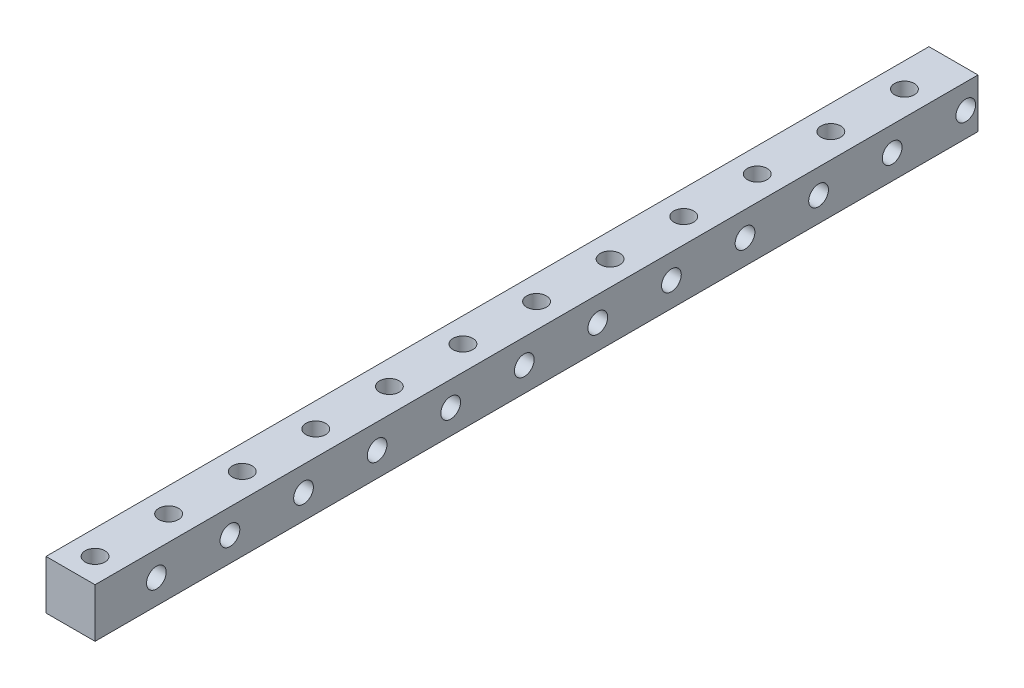
ISO-10303-21;
HEADER;
FILE_DESCRIPTION(('STEP AP214'),'2;1');
FILE_NAME('part.step','',(''),(''),'','','');
FILE_SCHEMA(('AUTOMOTIVE_DESIGN { 1 0 10303 214 1 1 1 1 }'));
ENDSEC;
DATA;
#1=APPLICATION_CONTEXT('core data for automotive mechanical design processes');
#2=APPLICATION_PROTOCOL_DEFINITION('international standard','automotive_design',2000,#1);
#3=PRODUCT_CONTEXT('',#1,'mechanical');
#4=PRODUCT('Part','Part','',(#3));
#5=PRODUCT_RELATED_PRODUCT_CATEGORY('part','',(#4));
#6=PRODUCT_DEFINITION_FORMATION('','',#4);
#7=PRODUCT_DEFINITION_CONTEXT('part definition',#1,'design');
#8=PRODUCT_DEFINITION('design','',#6,#7);
#9=PRODUCT_DEFINITION_SHAPE('','',#8);
#10=(LENGTH_UNIT() NAMED_UNIT(*) SI_UNIT(.MILLI.,.METRE.));
#11=(NAMED_UNIT(*) PLANE_ANGLE_UNIT() SI_UNIT($,.RADIAN.));
#12=(NAMED_UNIT(*) SI_UNIT($,.STERADIAN.) SOLID_ANGLE_UNIT());
#13=UNCERTAINTY_MEASURE_WITH_UNIT(LENGTH_MEASURE(1.E-05),#10,'distance_accuracy_value','');
#14=(GEOMETRIC_REPRESENTATION_CONTEXT(3) GLOBAL_UNCERTAINTY_ASSIGNED_CONTEXT((#13)) GLOBAL_UNIT_ASSIGNED_CONTEXT((#10,
#11,#12)) REPRESENTATION_CONTEXT('',''));
#15=CARTESIAN_POINT('',(0.,0.,0.));
#16=DIRECTION('',(0.,0.,1.));
#17=DIRECTION('',(1.,0.,0.));
#18=AXIS2_PLACEMENT_3D('',#15,#16,#17);
#19=CARTESIAN_POINT('',(6.35,0.,-225.425));
#20=DIRECTION('',(1.,0.,0.));
#21=DIRECTION('',(0.,0.,-1.));
#22=AXIS2_PLACEMENT_3D('',#19,#20,#21);
#23=CYLINDRICAL_SURFACE('',#22,2.55269999999999);
#24=CARTESIAN_POINT('',(6.35,0.,-225.425));
#25=DIRECTION('',(1.,0.,0.));
#26=DIRECTION('',(0.,0.,-1.));
#27=AXIS2_PLACEMENT_3D('',#24,#25,#26);
#28=CIRCLE('',#27,2.55269999999999);
#29=CARTESIAN_POINT('',(6.35,0.,-227.9777));
#30=VERTEX_POINT('',#29);
#31=EDGE_CURVE('E116',#30,#30,#28,.F.);
#32=ORIENTED_EDGE('',*,*,#31,.F.);
#33=EDGE_LOOP('',(#32));
#34=FACE_BOUND('',#33,.T.);
#35=CARTESIAN_POINT('',(-6.35,0.,-225.425));
#36=DIRECTION('',(1.,0.,0.));
#37=DIRECTION('',(0.,0.,-1.));
#38=AXIS2_PLACEMENT_3D('',#35,#36,#37);
#39=CIRCLE('',#38,2.55269999999999);
#40=CARTESIAN_POINT('',(-6.35,0.,-227.9777));
#41=VERTEX_POINT('',#40);
#42=EDGE_CURVE('E148',#41,#41,#39,.T.);
#43=ORIENTED_EDGE('',*,*,#42,.F.);
#44=EDGE_LOOP('',(#43));
#45=FACE_BOUND('',#44,.T.);
#46=ADVANCED_FACE('F41',(#34,#45),#23,.F.);
#47=CARTESIAN_POINT('',(6.35,0.,-206.375));
#48=DIRECTION('',(1.,0.,0.));
#49=DIRECTION('',(0.,0.,-1.));
#50=AXIS2_PLACEMENT_3D('',#47,#48,#49);
#51=CYLINDRICAL_SURFACE('',#50,2.55269999999999);
#52=CARTESIAN_POINT('',(6.35,0.,-206.375));
#53=DIRECTION('',(1.,0.,0.));
#54=DIRECTION('',(0.,0.,-1.));
#55=AXIS2_PLACEMENT_3D('',#52,#53,#54);
#56=CIRCLE('',#55,2.55269999999999);
#57=CARTESIAN_POINT('',(6.35,0.,-208.9277));
#58=VERTEX_POINT('',#57);
#59=EDGE_CURVE('E320',#58,#58,#56,.F.);
#60=ORIENTED_EDGE('',*,*,#59,.F.);
#61=EDGE_LOOP('',(#60));
#62=FACE_BOUND('',#61,.T.);
#63=CARTESIAN_POINT('',(-6.35,0.,-206.375));
#64=DIRECTION('',(1.,0.,0.));
#65=DIRECTION('',(0.,0.,-1.));
#66=AXIS2_PLACEMENT_3D('',#63,#64,#65);
#67=CIRCLE('',#66,2.55269999999999);
#68=CARTESIAN_POINT('',(-6.35,0.,-208.9277));
#69=VERTEX_POINT('',#68);
#70=EDGE_CURVE('E198',#69,#69,#67,.T.);
#71=ORIENTED_EDGE('',*,*,#70,.F.);
#72=EDGE_LOOP('',(#71));
#73=FACE_BOUND('',#72,.T.);
#74=ADVANCED_FACE('F330',(#62,#73),#51,.F.);
#75=CARTESIAN_POINT('',(6.35,0.,-187.325));
#76=DIRECTION('',(1.,0.,0.));
#77=DIRECTION('',(0.,0.,-1.));
#78=AXIS2_PLACEMENT_3D('',#75,#76,#77);
#79=CYLINDRICAL_SURFACE('',#78,2.55269999999999);
#80=CARTESIAN_POINT('',(6.35,0.,-187.325));
#81=DIRECTION('',(1.,0.,0.));
#82=DIRECTION('',(0.,0.,-1.));
#83=AXIS2_PLACEMENT_3D('',#80,#81,#82);
#84=CIRCLE('',#83,2.55269999999999);
#85=CARTESIAN_POINT('',(6.35,0.,-189.8777));
#86=VERTEX_POINT('',#85);
#87=EDGE_CURVE('E318',#86,#86,#84,.F.);
#88=ORIENTED_EDGE('',*,*,#87,.F.);
#89=EDGE_LOOP('',(#88));
#90=FACE_BOUND('',#89,.T.);
#91=CARTESIAN_POINT('',(-6.35,0.,-187.325));
#92=DIRECTION('',(1.,0.,0.));
#93=DIRECTION('',(0.,0.,-1.));
#94=AXIS2_PLACEMENT_3D('',#91,#92,#93);
#95=CIRCLE('',#94,2.55269999999999);
#96=CARTESIAN_POINT('',(-6.35,0.,-189.8777));
#97=VERTEX_POINT('',#96);
#98=EDGE_CURVE('E152',#97,#97,#95,.T.);
#99=ORIENTED_EDGE('',*,*,#98,.F.);
#100=EDGE_LOOP('',(#99));
#101=FACE_BOUND('',#100,.T.);
#102=ADVANCED_FACE('F364',(#90,#101),#79,.F.);
#103=CARTESIAN_POINT('',(6.35,0.,-168.275));
#104=DIRECTION('',(1.,0.,0.));
#105=DIRECTION('',(0.,0.,-1.));
#106=AXIS2_PLACEMENT_3D('',#103,#104,#105);
#107=CYLINDRICAL_SURFACE('',#106,2.55269999999999);
#108=CARTESIAN_POINT('',(6.35,0.,-168.275));
#109=DIRECTION('',(1.,0.,0.));
#110=DIRECTION('',(0.,0.,-1.));
#111=AXIS2_PLACEMENT_3D('',#108,#109,#110);
#112=CIRCLE('',#111,2.55269999999999);
#113=CARTESIAN_POINT('',(6.35,0.,-170.8277));
#114=VERTEX_POINT('',#113);
#115=EDGE_CURVE('E315',#114,#114,#112,.F.);
#116=ORIENTED_EDGE('',*,*,#115,.F.);
#117=EDGE_LOOP('',(#116));
#118=FACE_BOUND('',#117,.T.);
#119=CARTESIAN_POINT('',(-6.35,0.,-168.275));
#120=DIRECTION('',(1.,0.,0.));
#121=DIRECTION('',(0.,0.,-1.));
#122=AXIS2_PLACEMENT_3D('',#119,#120,#121);
#123=CIRCLE('',#122,2.55269999999999);
#124=CARTESIAN_POINT('',(-6.35,0.,-170.8277));
#125=VERTEX_POINT('',#124);
#126=EDGE_CURVE('E195',#125,#125,#123,.T.);
#127=ORIENTED_EDGE('',*,*,#126,.F.);
#128=EDGE_LOOP('',(#127));
#129=FACE_BOUND('',#128,.T.);
#130=ADVANCED_FACE('F361',(#118,#129),#107,.F.);
#131=CARTESIAN_POINT('',(6.35,0.,-149.225));
#132=DIRECTION('',(1.,0.,0.));
#133=DIRECTION('',(0.,0.,-1.));
#134=AXIS2_PLACEMENT_3D('',#131,#132,#133);
#135=CYLINDRICAL_SURFACE('',#134,2.55269999999999);
#136=CARTESIAN_POINT('',(6.35,0.,-149.225));
#137=DIRECTION('',(1.,0.,0.));
#138=DIRECTION('',(0.,0.,-1.));
#139=AXIS2_PLACEMENT_3D('',#136,#137,#138);
#140=CIRCLE('',#139,2.55269999999999);
#141=CARTESIAN_POINT('',(6.35,0.,-151.7777));
#142=VERTEX_POINT('',#141);
#143=EDGE_CURVE('E312',#142,#142,#140,.F.);
#144=ORIENTED_EDGE('',*,*,#143,.F.);
#145=EDGE_LOOP('',(#144));
#146=FACE_BOUND('',#145,.T.);
#147=CARTESIAN_POINT('',(-6.35,0.,-149.225));
#148=DIRECTION('',(1.,0.,0.));
#149=DIRECTION('',(0.,0.,-1.));
#150=AXIS2_PLACEMENT_3D('',#147,#148,#149);
#151=CIRCLE('',#150,2.55269999999999);
#152=CARTESIAN_POINT('',(-6.35,0.,-151.7777));
#153=VERTEX_POINT('',#152);
#154=EDGE_CURVE('E157',#153,#153,#151,.T.);
#155=ORIENTED_EDGE('',*,*,#154,.F.);
#156=EDGE_LOOP('',(#155));
#157=FACE_BOUND('',#156,.T.);
#158=ADVANCED_FACE('F363',(#146,#157),#135,.F.);
#159=CARTESIAN_POINT('',(6.35,0.,-130.175));
#160=DIRECTION('',(1.,0.,0.));
#161=DIRECTION('',(0.,0.,-1.));
#162=AXIS2_PLACEMENT_3D('',#159,#160,#161);
#163=CYLINDRICAL_SURFACE('',#162,2.55269999999999);
#164=CARTESIAN_POINT('',(6.35,0.,-130.175));
#165=DIRECTION('',(1.,0.,0.));
#166=DIRECTION('',(0.,0.,-1.));
#167=AXIS2_PLACEMENT_3D('',#164,#165,#166);
#168=CIRCLE('',#167,2.55269999999999);
#169=CARTESIAN_POINT('',(6.35,0.,-132.7277));
#170=VERTEX_POINT('',#169);
#171=EDGE_CURVE('E309',#170,#170,#168,.F.);
#172=ORIENTED_EDGE('',*,*,#171,.F.);
#173=EDGE_LOOP('',(#172));
#174=FACE_BOUND('',#173,.T.);
#175=CARTESIAN_POINT('',(-6.35,0.,-130.175));
#176=DIRECTION('',(1.,0.,0.));
#177=DIRECTION('',(0.,0.,-1.));
#178=AXIS2_PLACEMENT_3D('',#175,#176,#177);
#179=CIRCLE('',#178,2.55269999999999);
#180=CARTESIAN_POINT('',(-6.35,0.,-132.7277));
#181=VERTEX_POINT('',#180);
#182=EDGE_CURVE('E161',#181,#181,#179,.T.);
#183=ORIENTED_EDGE('',*,*,#182,.F.);
#184=EDGE_LOOP('',(#183));
#185=FACE_BOUND('',#184,.T.);
#186=ADVANCED_FACE('F372',(#174,#185),#163,.F.);
#187=CARTESIAN_POINT('',(6.35,0.,-111.125));
#188=DIRECTION('',(1.,0.,0.));
#189=DIRECTION('',(0.,0.,-1.));
#190=AXIS2_PLACEMENT_3D('',#187,#188,#189);
#191=CYLINDRICAL_SURFACE('',#190,2.55269999999999);
#192=CARTESIAN_POINT('',(6.35,0.,-111.125));
#193=DIRECTION('',(1.,0.,0.));
#194=DIRECTION('',(0.,0.,-1.));
#195=AXIS2_PLACEMENT_3D('',#192,#193,#194);
#196=CIRCLE('',#195,2.55269999999999);
#197=CARTESIAN_POINT('',(6.35,0.,-113.6777));
#198=VERTEX_POINT('',#197);
#199=EDGE_CURVE('E306',#198,#198,#196,.F.);
#200=ORIENTED_EDGE('',*,*,#199,.F.);
#201=EDGE_LOOP('',(#200));
#202=FACE_BOUND('',#201,.T.);
#203=CARTESIAN_POINT('',(-6.35,0.,-111.125));
#204=DIRECTION('',(1.,0.,0.));
#205=DIRECTION('',(0.,0.,-1.));
#206=AXIS2_PLACEMENT_3D('',#203,#204,#205);
#207=CIRCLE('',#206,2.55269999999999);
#208=CARTESIAN_POINT('',(-6.35,0.,-113.6777));
#209=VERTEX_POINT('',#208);
#210=EDGE_CURVE('E169',#209,#209,#207,.T.);
#211=ORIENTED_EDGE('',*,*,#210,.F.);
#212=EDGE_LOOP('',(#211));
#213=FACE_BOUND('',#212,.T.);
#214=ADVANCED_FACE('F460',(#202,#213),#191,.F.);
#215=CARTESIAN_POINT('',(6.35,0.,-92.075));
#216=DIRECTION('',(1.,0.,0.));
#217=DIRECTION('',(0.,0.,-1.));
#218=AXIS2_PLACEMENT_3D('',#215,#216,#217);
#219=CYLINDRICAL_SURFACE('',#218,2.55270000000001);
#220=CARTESIAN_POINT('',(6.35,0.,-92.075));
#221=DIRECTION('',(1.,0.,0.));
#222=DIRECTION('',(0.,0.,-1.));
#223=AXIS2_PLACEMENT_3D('',#220,#221,#222);
#224=CIRCLE('',#223,2.55270000000001);
#225=CARTESIAN_POINT('',(6.35,0.,-94.6277));
#226=VERTEX_POINT('',#225);
#227=EDGE_CURVE('E303',#226,#226,#224,.F.);
#228=ORIENTED_EDGE('',*,*,#227,.F.);
#229=EDGE_LOOP('',(#228));
#230=FACE_BOUND('',#229,.T.);
#231=CARTESIAN_POINT('',(-6.35,0.,-92.075));
#232=DIRECTION('',(1.,0.,0.));
#233=DIRECTION('',(0.,0.,-1.));
#234=AXIS2_PLACEMENT_3D('',#231,#232,#233);
#235=CIRCLE('',#234,2.55270000000001);
#236=CARTESIAN_POINT('',(-6.35,0.,-94.6277));
#237=VERTEX_POINT('',#236);
#238=EDGE_CURVE('E172',#237,#237,#235,.T.);
#239=ORIENTED_EDGE('',*,*,#238,.F.);
#240=EDGE_LOOP('',(#239));
#241=FACE_BOUND('',#240,.T.);
#242=ADVANCED_FACE('F456',(#230,#241),#219,.F.);
#243=CARTESIAN_POINT('',(6.35,0.,-73.025));
#244=DIRECTION('',(1.,0.,0.));
#245=DIRECTION('',(0.,0.,-1.));
#246=AXIS2_PLACEMENT_3D('',#243,#244,#245);
#247=CYLINDRICAL_SURFACE('',#246,2.55269999999999);
#248=CARTESIAN_POINT('',(6.35,0.,-73.025));
#249=DIRECTION('',(1.,0.,0.));
#250=DIRECTION('',(0.,0.,-1.));
#251=AXIS2_PLACEMENT_3D('',#248,#249,#250);
#252=CIRCLE('',#251,2.55269999999999);
#253=CARTESIAN_POINT('',(6.35,0.,-75.5777));
#254=VERTEX_POINT('',#253);
#255=EDGE_CURVE('E300',#254,#254,#252,.F.);
#256=ORIENTED_EDGE('',*,*,#255,.F.);
#257=EDGE_LOOP('',(#256));
#258=FACE_BOUND('',#257,.T.);
#259=CARTESIAN_POINT('',(-6.35,0.,-73.025));
#260=DIRECTION('',(1.,0.,0.));
#261=DIRECTION('',(0.,0.,-1.));
#262=AXIS2_PLACEMENT_3D('',#259,#260,#261);
#263=CIRCLE('',#262,2.55269999999999);
#264=CARTESIAN_POINT('',(-6.35,0.,-75.5777));
#265=VERTEX_POINT('',#264);
#266=EDGE_CURVE('E176',#265,#265,#263,.T.);
#267=ORIENTED_EDGE('',*,*,#266,.F.);
#268=EDGE_LOOP('',(#267));
#269=FACE_BOUND('',#268,.T.);
#270=ADVANCED_FACE('F452',(#258,#269),#247,.F.);
#271=CARTESIAN_POINT('',(6.35,0.,-53.975));
#272=DIRECTION('',(1.,0.,0.));
#273=DIRECTION('',(0.,0.,-1.));
#274=AXIS2_PLACEMENT_3D('',#271,#272,#273);
#275=CYLINDRICAL_SURFACE('',#274,2.5527);
#276=CARTESIAN_POINT('',(6.35,0.,-53.975));
#277=DIRECTION('',(1.,0.,0.));
#278=DIRECTION('',(0.,0.,-1.));
#279=AXIS2_PLACEMENT_3D('',#276,#277,#278);
#280=CIRCLE('',#279,2.5527);
#281=CARTESIAN_POINT('',(6.35,0.,-56.5277));
#282=VERTEX_POINT('',#281);
#283=EDGE_CURVE('E297',#282,#282,#280,.F.);
#284=ORIENTED_EDGE('',*,*,#283,.F.);
#285=EDGE_LOOP('',(#284));
#286=FACE_BOUND('',#285,.T.);
#287=CARTESIAN_POINT('',(-6.35,0.,-53.975));
#288=DIRECTION('',(1.,0.,0.));
#289=DIRECTION('',(0.,0.,-1.));
#290=AXIS2_PLACEMENT_3D('',#287,#288,#289);
#291=CIRCLE('',#290,2.5527);
#292=CARTESIAN_POINT('',(-6.35,0.,-56.5277));
#293=VERTEX_POINT('',#292);
#294=EDGE_CURVE('E180',#293,#293,#291,.T.);
#295=ORIENTED_EDGE('',*,*,#294,.F.);
#296=EDGE_LOOP('',(#295));
#297=FACE_BOUND('',#296,.T.);
#298=ADVANCED_FACE('F448',(#286,#297),#275,.F.);
#299=CARTESIAN_POINT('',(6.35,0.,-34.925));
#300=DIRECTION('',(1.,0.,0.));
#301=DIRECTION('',(0.,0.,-1.));
#302=AXIS2_PLACEMENT_3D('',#299,#300,#301);
#303=CYLINDRICAL_SURFACE('',#302,2.5527);
#304=CARTESIAN_POINT('',(6.35,0.,-34.925));
#305=DIRECTION('',(1.,0.,0.));
#306=DIRECTION('',(0.,0.,-1.));
#307=AXIS2_PLACEMENT_3D('',#304,#305,#306);
#308=CIRCLE('',#307,2.5527);
#309=CARTESIAN_POINT('',(6.35,0.,-37.4777));
#310=VERTEX_POINT('',#309);
#311=EDGE_CURVE('E294',#310,#310,#308,.F.);
#312=ORIENTED_EDGE('',*,*,#311,.F.);
#313=EDGE_LOOP('',(#312));
#314=FACE_BOUND('',#313,.T.);
#315=CARTESIAN_POINT('',(-6.35,0.,-34.925));
#316=DIRECTION('',(1.,0.,0.));
#317=DIRECTION('',(0.,0.,-1.));
#318=AXIS2_PLACEMENT_3D('',#315,#316,#317);
#319=CIRCLE('',#318,2.5527);
#320=CARTESIAN_POINT('',(-6.35,0.,-37.4777));
#321=VERTEX_POINT('',#320);
#322=EDGE_CURVE('E188',#321,#321,#319,.T.);
#323=ORIENTED_EDGE('',*,*,#322,.F.);
#324=EDGE_LOOP('',(#323));
#325=FACE_BOUND('',#324,.T.);
#326=ADVANCED_FACE('F444',(#314,#325),#303,.F.);
#327=CARTESIAN_POINT('',(6.35,0.,-15.875));
#328=DIRECTION('',(1.,0.,0.));
#329=DIRECTION('',(0.,0.,-1.));
#330=AXIS2_PLACEMENT_3D('',#327,#328,#329);
#331=CYLINDRICAL_SURFACE('',#330,2.5527);
#332=CARTESIAN_POINT('',(6.35,0.,-15.875));
#333=DIRECTION('',(1.,0.,0.));
#334=DIRECTION('',(0.,0.,-1.));
#335=AXIS2_PLACEMENT_3D('',#332,#333,#334);
#336=CIRCLE('',#335,2.5527);
#337=CARTESIAN_POINT('',(6.35,0.,-18.4277));
#338=VERTEX_POINT('',#337);
#339=EDGE_CURVE('E291',#338,#338,#336,.F.);
#340=ORIENTED_EDGE('',*,*,#339,.F.);
#341=EDGE_LOOP('',(#340));
#342=FACE_BOUND('',#341,.T.);
#343=CARTESIAN_POINT('',(-6.35,0.,-15.875));
#344=DIRECTION('',(1.,0.,0.));
#345=DIRECTION('',(0.,0.,-1.));
#346=AXIS2_PLACEMENT_3D('',#343,#344,#345);
#347=CIRCLE('',#346,2.5527);
#348=CARTESIAN_POINT('',(-6.35,0.,-18.4277));
#349=VERTEX_POINT('',#348);
#350=EDGE_CURVE('E191',#349,#349,#347,.T.);
#351=ORIENTED_EDGE('',*,*,#350,.F.);
#352=EDGE_LOOP('',(#351));
#353=FACE_BOUND('',#352,.T.);
#354=ADVANCED_FACE('F440',(#342,#353),#331,.F.);
#355=CARTESIAN_POINT('',(6.35,-6.35,-304.8));
#356=DIRECTION('',(0.,-1.,0.));
#357=DIRECTION('',(1.,0.,0.));
#358=AXIS2_PLACEMENT_3D('',#355,#356,#357);
#359=PLANE('',#358);
#360=DIRECTION('',(1.,0.,0.));
#361=VECTOR('',#360,1.);
#362=CARTESIAN_POINT('',(-19.05,-6.35,-228.6));
#363=LINE('',#362,#361);
#364=CARTESIAN_POINT('',(-6.35,-6.35,-228.6));
#365=VERTEX_POINT('',#364);
#366=CARTESIAN_POINT('',(6.35,-6.35,-228.6));
#367=VERTEX_POINT('',#366);
#368=EDGE_CURVE('E82',#365,#367,#363,.T.);
#369=ORIENTED_EDGE('',*,*,#368,.T.);
#370=DIRECTION('',(0.,0.,-1.));
#371=VECTOR('',#370,1.);
#372=CARTESIAN_POINT('',(6.35,-6.35,-304.8));
#373=LINE('',#372,#371);
#374=CARTESIAN_POINT('',(6.35,-6.35,0.));
#375=VERTEX_POINT('',#374);
#376=EDGE_CURVE('E98',#375,#367,#373,.T.);
#377=ORIENTED_EDGE('',*,*,#376,.F.);
#378=DIRECTION('',(1.,0.,0.));
#379=VECTOR('',#378,1.);
#380=CARTESIAN_POINT('',(-6.35,-6.35,0.));
#381=LINE('',#380,#379);
#382=CARTESIAN_POINT('',(-6.35,-6.35000000000003,0.));
#383=VERTEX_POINT('',#382);
#384=EDGE_CURVE('E118',#383,#375,#381,.T.);
#385=ORIENTED_EDGE('',*,*,#384,.F.);
#386=DIRECTION('',(0.,0.,1.));
#387=VECTOR('',#386,1.);
#388=CARTESIAN_POINT('',(-6.35,-6.35000000000005,-304.8));
#389=LINE('',#388,#387);
#390=EDGE_CURVE('E77',#365,#383,#389,.T.);
#391=ORIENTED_EDGE('',*,*,#390,.F.);
#392=EDGE_LOOP('',(#369,#377,#385,#391));
#393=FACE_BOUND('',#392,.T.);
#394=CARTESIAN_POINT('',(0.,-6.35,-215.9));
#395=DIRECTION('',(0.,1.,0.));
#396=DIRECTION('',(0.,0.,1.));
#397=AXIS2_PLACEMENT_3D('',#394,#395,#396);
#398=CIRCLE('',#397,2.55269999999999);
#399=CARTESIAN_POINT('',(0.,-6.35,-213.3473));
#400=VERTEX_POINT('',#399);
#401=EDGE_CURVE('E287',#400,#400,#398,.T.);
#402=ORIENTED_EDGE('',*,*,#401,.T.);
#403=EDGE_LOOP('',(#402));
#404=FACE_BOUND('',#403,.T.);
#405=CARTESIAN_POINT('',(0.,-6.35,-196.85));
#406=DIRECTION('',(0.,1.,0.));
#407=DIRECTION('',(0.,0.,1.));
#408=AXIS2_PLACEMENT_3D('',#405,#406,#407);
#409=CIRCLE('',#408,2.55269999999999);
#410=CARTESIAN_POINT('',(0.,-6.35,-194.2973));
#411=VERTEX_POINT('',#410);
#412=EDGE_CURVE('E284',#411,#411,#409,.T.);
#413=ORIENTED_EDGE('',*,*,#412,.T.);
#414=EDGE_LOOP('',(#413));
#415=FACE_BOUND('',#414,.T.);
#416=CARTESIAN_POINT('',(0.,-6.35,-177.8));
#417=DIRECTION('',(0.,1.,0.));
#418=DIRECTION('',(0.,0.,1.));
#419=AXIS2_PLACEMENT_3D('',#416,#417,#418);
#420=CIRCLE('',#419,2.55269999999999);
#421=CARTESIAN_POINT('',(0.,-6.35,-175.2473));
#422=VERTEX_POINT('',#421);
#423=EDGE_CURVE('E280',#422,#422,#420,.T.);
#424=ORIENTED_EDGE('',*,*,#423,.T.);
#425=EDGE_LOOP('',(#424));
#426=FACE_BOUND('',#425,.T.);
#427=CARTESIAN_POINT('',(0.,-6.35,-158.75));
#428=DIRECTION('',(0.,1.,0.));
#429=DIRECTION('',(0.,0.,1.));
#430=AXIS2_PLACEMENT_3D('',#427,#428,#429);
#431=CIRCLE('',#430,2.55269999999999);
#432=CARTESIAN_POINT('',(0.,-6.35,-156.1973));
#433=VERTEX_POINT('',#432);
#434=EDGE_CURVE('E276',#433,#433,#431,.T.);
#435=ORIENTED_EDGE('',*,*,#434,.T.);
#436=EDGE_LOOP('',(#435));
#437=FACE_BOUND('',#436,.T.);
#438=CARTESIAN_POINT('',(0.,-6.35,-139.7));
#439=DIRECTION('',(0.,1.,0.));
#440=DIRECTION('',(0.,0.,1.));
#441=AXIS2_PLACEMENT_3D('',#438,#439,#440);
#442=CIRCLE('',#441,2.55269999999999);
#443=CARTESIAN_POINT('',(0.,-6.35,-137.1473));
#444=VERTEX_POINT('',#443);
#445=EDGE_CURVE('E272',#444,#444,#442,.T.);
#446=ORIENTED_EDGE('',*,*,#445,.T.);
#447=EDGE_LOOP('',(#446));
#448=FACE_BOUND('',#447,.T.);
#449=CARTESIAN_POINT('',(0.,-6.35,-120.65));
#450=DIRECTION('',(0.,1.,0.));
#451=DIRECTION('',(0.,0.,1.));
#452=AXIS2_PLACEMENT_3D('',#449,#450,#451);
#453=CIRCLE('',#452,2.55269999999999);
#454=CARTESIAN_POINT('',(0.,-6.35,-118.0973));
#455=VERTEX_POINT('',#454);
#456=EDGE_CURVE('E269',#455,#455,#453,.T.);
#457=ORIENTED_EDGE('',*,*,#456,.T.);
#458=EDGE_LOOP('',(#457));
#459=FACE_BOUND('',#458,.T.);
#460=CARTESIAN_POINT('',(0.,-6.35,-101.6));
#461=DIRECTION('',(0.,1.,0.));
#462=DIRECTION('',(0.,0.,1.));
#463=AXIS2_PLACEMENT_3D('',#460,#461,#462);
#464=CIRCLE('',#463,2.55269999999999);
#465=CARTESIAN_POINT('',(0.,-6.35,-99.0473));
#466=VERTEX_POINT('',#465);
#467=EDGE_CURVE('E261',#466,#466,#464,.T.);
#468=ORIENTED_EDGE('',*,*,#467,.T.);
#469=EDGE_LOOP('',(#468));
#470=FACE_BOUND('',#469,.T.);
#471=CARTESIAN_POINT('',(0.,-6.35,-82.55));
#472=DIRECTION('',(0.,1.,0.));
#473=DIRECTION('',(0.,0.,1.));
#474=AXIS2_PLACEMENT_3D('',#471,#472,#473);
#475=CIRCLE('',#474,2.55269999999999);
#476=CARTESIAN_POINT('',(0.,-6.35,-79.9973));
#477=VERTEX_POINT('',#476);
#478=EDGE_CURVE('E257',#477,#477,#475,.T.);
#479=ORIENTED_EDGE('',*,*,#478,.T.);
#480=EDGE_LOOP('',(#479));
#481=FACE_BOUND('',#480,.T.);
#482=CARTESIAN_POINT('',(0.,-6.35,-63.5));
#483=DIRECTION('',(0.,1.,0.));
#484=DIRECTION('',(0.,0.,1.));
#485=AXIS2_PLACEMENT_3D('',#482,#483,#484);
#486=CIRCLE('',#485,2.5527);
#487=CARTESIAN_POINT('',(0.,-6.35,-60.9473));
#488=VERTEX_POINT('',#487);
#489=EDGE_CURVE('E253',#488,#488,#486,.T.);
#490=ORIENTED_EDGE('',*,*,#489,.T.);
#491=EDGE_LOOP('',(#490));
#492=FACE_BOUND('',#491,.T.);
#493=CARTESIAN_POINT('',(0.,-6.35,-44.45));
#494=DIRECTION('',(0.,1.,0.));
#495=DIRECTION('',(0.,0.,1.));
#496=AXIS2_PLACEMENT_3D('',#493,#494,#495);
#497=CIRCLE('',#496,2.5527);
#498=CARTESIAN_POINT('',(0.,-6.35,-41.8973));
#499=VERTEX_POINT('',#498);
#500=EDGE_CURVE('E250',#499,#499,#497,.T.);
#501=ORIENTED_EDGE('',*,*,#500,.T.);
#502=EDGE_LOOP('',(#501));
#503=FACE_BOUND('',#502,.T.);
#504=CARTESIAN_POINT('',(0.,-6.35,-25.4));
#505=DIRECTION('',(0.,1.,0.));
#506=DIRECTION('',(0.,0.,1.));
#507=AXIS2_PLACEMENT_3D('',#504,#505,#506);
#508=CIRCLE('',#507,2.5527);
#509=CARTESIAN_POINT('',(0.,-6.35,-22.8473));
#510=VERTEX_POINT('',#509);
#511=EDGE_CURVE('E241',#510,#510,#508,.T.);
#512=ORIENTED_EDGE('',*,*,#511,.T.);
#513=EDGE_LOOP('',(#512));
#514=FACE_BOUND('',#513,.T.);
#515=CARTESIAN_POINT('',(0.,-6.35,-6.35));
#516=DIRECTION('',(0.,1.,0.));
#517=DIRECTION('',(0.,0.,1.));
#518=AXIS2_PLACEMENT_3D('',#515,#516,#517);
#519=CIRCLE('',#518,2.5527);
#520=CARTESIAN_POINT('',(0.,-6.35,-3.7973));
#521=VERTEX_POINT('',#520);
#522=EDGE_CURVE('E114',#521,#521,#519,.T.);
#523=ORIENTED_EDGE('',*,*,#522,.T.);
#524=EDGE_LOOP('',(#523));
#525=FACE_BOUND('',#524,.T.);
#526=ADVANCED_FACE('F337',(#393,#404,#415,#426,#437,#448,#459,#470,#481,#492,#503,#514,#525),
#359,.T.);
#527=CARTESIAN_POINT('',(-6.35,-6.35,-304.8));
#528=DIRECTION('',(-1.,0.,0.));
#529=DIRECTION('',(0.,0.,1.));
#530=AXIS2_PLACEMENT_3D('',#527,#528,#529);
#531=PLANE('',#530);
#532=DIRECTION('',(0.,1.,0.));
#533=VECTOR('',#532,1.);
#534=CARTESIAN_POINT('',(-6.35,-6.35,-228.6));
#535=LINE('',#534,#533);
#536=CARTESIAN_POINT('',(-6.35,6.35,-228.6));
#537=VERTEX_POINT('',#536);
#538=EDGE_CURVE('E54',#365,#537,#535,.T.);
#539=ORIENTED_EDGE('',*,*,#538,.F.);
#540=ORIENTED_EDGE('',*,*,#390,.T.);
#541=DIRECTION('',(0.,1.,0.));
#542=VECTOR('',#541,1.);
#543=CARTESIAN_POINT('',(-6.35,6.35,0.));
#544=LINE('',#543,#542);
#545=CARTESIAN_POINT('',(-6.35,6.35,0.));
#546=VERTEX_POINT('',#545);
#547=EDGE_CURVE('E121',#546,#383,#544,.F.);
#548=ORIENTED_EDGE('',*,*,#547,.F.);
#549=DIRECTION('',(0.,0.,1.));
#550=VECTOR('',#549,1.);
#551=CARTESIAN_POINT('',(-6.35,6.35,-304.8));
#552=LINE('',#551,#550);
#553=EDGE_CURVE('E108',#537,#546,#552,.T.);
#554=ORIENTED_EDGE('',*,*,#553,.F.);
#555=EDGE_LOOP('',(#539,#540,#548,#554));
#556=FACE_BOUND('',#555,.T.);
#557=ORIENTED_EDGE('',*,*,#42,.T.);
#558=EDGE_LOOP('',(#557));
#559=FACE_BOUND('',#558,.T.);
#560=ORIENTED_EDGE('',*,*,#98,.T.);
#561=EDGE_LOOP('',(#560));
#562=FACE_BOUND('',#561,.T.);
#563=ORIENTED_EDGE('',*,*,#154,.T.);
#564=EDGE_LOOP('',(#563));
#565=FACE_BOUND('',#564,.T.);
#566=ORIENTED_EDGE('',*,*,#182,.T.);
#567=EDGE_LOOP('',(#566));
#568=FACE_BOUND('',#567,.T.);
#569=ORIENTED_EDGE('',*,*,#210,.T.);
#570=EDGE_LOOP('',(#569));
#571=FACE_BOUND('',#570,.T.);
#572=ORIENTED_EDGE('',*,*,#238,.T.);
#573=EDGE_LOOP('',(#572));
#574=FACE_BOUND('',#573,.T.);
#575=ORIENTED_EDGE('',*,*,#266,.T.);
#576=EDGE_LOOP('',(#575));
#577=FACE_BOUND('',#576,.T.);
#578=ORIENTED_EDGE('',*,*,#294,.T.);
#579=EDGE_LOOP('',(#578));
#580=FACE_BOUND('',#579,.T.);
#581=ORIENTED_EDGE('',*,*,#322,.T.);
#582=EDGE_LOOP('',(#581));
#583=FACE_BOUND('',#582,.T.);
#584=ORIENTED_EDGE('',*,*,#350,.T.);
#585=EDGE_LOOP('',(#584));
#586=FACE_BOUND('',#585,.T.);
#587=ORIENTED_EDGE('',*,*,#126,.T.);
#588=EDGE_LOOP('',(#587));
#589=FACE_BOUND('',#588,.T.);
#590=ORIENTED_EDGE('',*,*,#70,.T.);
#591=EDGE_LOOP('',(#590));
#592=FACE_BOUND('',#591,.T.);
#593=ADVANCED_FACE('F333',(#556,#559,#562,#565,#568,#571,#574,#577,#580,#583,#586,#589,#592),
#531,.T.);
#594=CARTESIAN_POINT('',(-6.35,6.35,0.));
#595=DIRECTION('',(0.,0.,1.));
#596=DIRECTION('',(1.,0.,0.));
#597=AXIS2_PLACEMENT_3D('',#594,#595,#596);
#598=PLANE('',#597);
#599=DIRECTION('',(0.,1.,0.));
#600=VECTOR('',#599,1.);
#601=CARTESIAN_POINT('',(6.35,-6.35,0.));
#602=LINE('',#601,#600);
#603=CARTESIAN_POINT('',(6.35,6.35,0.));
#604=VERTEX_POINT('',#603);
#605=EDGE_CURVE('E63',#604,#375,#602,.F.);
#606=ORIENTED_EDGE('',*,*,#605,.F.);
#607=DIRECTION('',(-1.,0.,0.));
#608=VECTOR('',#607,1.);
#609=CARTESIAN_POINT('',(6.35,6.35,0.));
#610=LINE('',#609,#608);
#611=EDGE_CURVE('E102',#546,#604,#610,.F.);
#612=ORIENTED_EDGE('',*,*,#611,.F.);
#613=ORIENTED_EDGE('',*,*,#547,.T.);
#614=ORIENTED_EDGE('',*,*,#384,.T.);
#615=EDGE_LOOP('',(#606,#612,#613,#614));
#616=FACE_BOUND('',#615,.T.);
#617=ADVANCED_FACE('F336',(#616),#598,.T.);
#618=CARTESIAN_POINT('',(6.35,-6.35,-304.8));
#619=DIRECTION('',(1.,0.,0.));
#620=DIRECTION('',(0.,0.,-1.));
#621=AXIS2_PLACEMENT_3D('',#618,#619,#620);
#622=PLANE('',#621);
#623=DIRECTION('',(0.,-1.,0.));
#624=VECTOR('',#623,1.);
#625=CARTESIAN_POINT('',(6.35,6.35,-228.6));
#626=LINE('',#625,#624);
#627=CARTESIAN_POINT('',(6.35,6.35,-228.6));
#628=VERTEX_POINT('',#627);
#629=EDGE_CURVE('E85',#628,#367,#626,.T.);
#630=ORIENTED_EDGE('',*,*,#629,.F.);
#631=DIRECTION('',(0.,0.,1.));
#632=VECTOR('',#631,1.);
#633=CARTESIAN_POINT('',(6.35,6.35,-304.8));
#634=LINE('',#633,#632);
#635=EDGE_CURVE('E95',#604,#628,#634,.F.);
#636=ORIENTED_EDGE('',*,*,#635,.F.);
#637=ORIENTED_EDGE('',*,*,#605,.T.);
#638=ORIENTED_EDGE('',*,*,#376,.T.);
#639=EDGE_LOOP('',(#630,#636,#637,#638));
#640=FACE_BOUND('',#639,.T.);
#641=ORIENTED_EDGE('',*,*,#339,.T.);
#642=EDGE_LOOP('',(#641));
#643=FACE_BOUND('',#642,.T.);
#644=ORIENTED_EDGE('',*,*,#311,.T.);
#645=EDGE_LOOP('',(#644));
#646=FACE_BOUND('',#645,.T.);
#647=ORIENTED_EDGE('',*,*,#283,.T.);
#648=EDGE_LOOP('',(#647));
#649=FACE_BOUND('',#648,.T.);
#650=ORIENTED_EDGE('',*,*,#255,.T.);
#651=EDGE_LOOP('',(#650));
#652=FACE_BOUND('',#651,.T.);
#653=ORIENTED_EDGE('',*,*,#227,.T.);
#654=EDGE_LOOP('',(#653));
#655=FACE_BOUND('',#654,.T.);
#656=ORIENTED_EDGE('',*,*,#199,.T.);
#657=EDGE_LOOP('',(#656));
#658=FACE_BOUND('',#657,.T.);
#659=ORIENTED_EDGE('',*,*,#171,.T.);
#660=EDGE_LOOP('',(#659));
#661=FACE_BOUND('',#660,.T.);
#662=ORIENTED_EDGE('',*,*,#143,.T.);
#663=EDGE_LOOP('',(#662));
#664=FACE_BOUND('',#663,.T.);
#665=ORIENTED_EDGE('',*,*,#115,.T.);
#666=EDGE_LOOP('',(#665));
#667=FACE_BOUND('',#666,.T.);
#668=ORIENTED_EDGE('',*,*,#87,.T.);
#669=EDGE_LOOP('',(#668));
#670=FACE_BOUND('',#669,.T.);
#671=ORIENTED_EDGE('',*,*,#59,.T.);
#672=EDGE_LOOP('',(#671));
#673=FACE_BOUND('',#672,.T.);
#674=ORIENTED_EDGE('',*,*,#31,.T.);
#675=EDGE_LOOP('',(#674));
#676=FACE_BOUND('',#675,.T.);
#677=ADVANCED_FACE('F93',(#640,#643,#646,#649,#652,#655,#658,#661,#664,#667,#670,#673,#676),
#622,.T.);
#678=CARTESIAN_POINT('',(0.,6.35,-215.9));
#679=DIRECTION('',(0.,1.,0.));
#680=DIRECTION('',(0.,0.,1.));
#681=AXIS2_PLACEMENT_3D('',#678,#679,#680);
#682=CYLINDRICAL_SURFACE('',#681,2.55269999999999);
#683=CARTESIAN_POINT('',(0.,6.35,-215.9));
#684=DIRECTION('',(0.,1.,0.));
#685=DIRECTION('',(0.,0.,1.));
#686=AXIS2_PLACEMENT_3D('',#683,#684,#685);
#687=CIRCLE('',#686,2.55269999999999);
#688=CARTESIAN_POINT('',(0.,6.35,-213.3473));
#689=VERTEX_POINT('',#688);
#690=EDGE_CURVE('E103',#689,#689,#687,.F.);
#691=ORIENTED_EDGE('',*,*,#690,.F.);
#692=EDGE_LOOP('',(#691));
#693=FACE_BOUND('',#692,.T.);
#694=ORIENTED_EDGE('',*,*,#401,.F.);
#695=EDGE_LOOP('',(#694));
#696=FACE_BOUND('',#695,.T.);
#697=ADVANCED_FACE('F430',(#693,#696),#682,.F.);
#698=CARTESIAN_POINT('',(0.,6.35,-196.85));
#699=DIRECTION('',(0.,1.,0.));
#700=DIRECTION('',(0.,0.,1.));
#701=AXIS2_PLACEMENT_3D('',#698,#699,#700);
#702=CYLINDRICAL_SURFACE('',#701,2.55269999999999);
#703=CARTESIAN_POINT('',(0.,6.35,-196.85));
#704=DIRECTION('',(0.,1.,0.));
#705=DIRECTION('',(0.,0.,1.));
#706=AXIS2_PLACEMENT_3D('',#703,#704,#705);
#707=CIRCLE('',#706,2.55269999999999);
#708=CARTESIAN_POINT('',(0.,6.35,-194.2973));
#709=VERTEX_POINT('',#708);
#710=EDGE_CURVE('E106',#709,#709,#707,.F.);
#711=ORIENTED_EDGE('',*,*,#710,.F.);
#712=EDGE_LOOP('',(#711));
#713=FACE_BOUND('',#712,.T.);
#714=ORIENTED_EDGE('',*,*,#412,.F.);
#715=EDGE_LOOP('',(#714));
#716=FACE_BOUND('',#715,.T.);
#717=ADVANCED_FACE('F426',(#713,#716),#702,.F.);
#718=CARTESIAN_POINT('',(0.,6.35,-177.8));
#719=DIRECTION('',(0.,1.,0.));
#720=DIRECTION('',(0.,0.,1.));
#721=AXIS2_PLACEMENT_3D('',#718,#719,#720);
#722=CYLINDRICAL_SURFACE('',#721,2.55269999999999);
#723=CARTESIAN_POINT('',(0.,6.35,-177.8));
#724=DIRECTION('',(0.,1.,0.));
#725=DIRECTION('',(0.,0.,1.));
#726=AXIS2_PLACEMENT_3D('',#723,#724,#725);
#727=CIRCLE('',#726,2.55269999999999);
#728=CARTESIAN_POINT('',(0.,6.35,-175.2473));
#729=VERTEX_POINT('',#728);
#730=EDGE_CURVE('E233',#729,#729,#727,.F.);
#731=ORIENTED_EDGE('',*,*,#730,.F.);
#732=EDGE_LOOP('',(#731));
#733=FACE_BOUND('',#732,.T.);
#734=ORIENTED_EDGE('',*,*,#423,.F.);
#735=EDGE_LOOP('',(#734));
#736=FACE_BOUND('',#735,.T.);
#737=ADVANCED_FACE('F422',(#733,#736),#722,.F.);
#738=CARTESIAN_POINT('',(0.,6.35,-158.75));
#739=DIRECTION('',(0.,1.,0.));
#740=DIRECTION('',(0.,0.,1.));
#741=AXIS2_PLACEMENT_3D('',#738,#739,#740);
#742=CYLINDRICAL_SURFACE('',#741,2.55269999999999);
#743=CARTESIAN_POINT('',(0.,6.35,-158.75));
#744=DIRECTION('',(0.,1.,0.));
#745=DIRECTION('',(0.,0.,1.));
#746=AXIS2_PLACEMENT_3D('',#743,#744,#745);
#747=CIRCLE('',#746,2.55269999999999);
#748=CARTESIAN_POINT('',(0.,6.35,-156.1973));
#749=VERTEX_POINT('',#748);
#750=EDGE_CURVE('E230',#749,#749,#747,.F.);
#751=ORIENTED_EDGE('',*,*,#750,.F.);
#752=EDGE_LOOP('',(#751));
#753=FACE_BOUND('',#752,.T.);
#754=ORIENTED_EDGE('',*,*,#434,.F.);
#755=EDGE_LOOP('',(#754));
#756=FACE_BOUND('',#755,.T.);
#757=ADVANCED_FACE('F418',(#753,#756),#742,.F.);
#758=CARTESIAN_POINT('',(0.,6.35,-139.7));
#759=DIRECTION('',(0.,1.,0.));
#760=DIRECTION('',(0.,0.,1.));
#761=AXIS2_PLACEMENT_3D('',#758,#759,#760);
#762=CYLINDRICAL_SURFACE('',#761,2.55269999999999);
#763=CARTESIAN_POINT('',(0.,6.35,-139.7));
#764=DIRECTION('',(0.,1.,0.));
#765=DIRECTION('',(0.,0.,1.));
#766=AXIS2_PLACEMENT_3D('',#763,#764,#765);
#767=CIRCLE('',#766,2.55269999999999);
#768=CARTESIAN_POINT('',(0.,6.35,-137.1473));
#769=VERTEX_POINT('',#768);
#770=EDGE_CURVE('E227',#769,#769,#767,.F.);
#771=ORIENTED_EDGE('',*,*,#770,.F.);
#772=EDGE_LOOP('',(#771));
#773=FACE_BOUND('',#772,.T.);
#774=ORIENTED_EDGE('',*,*,#445,.F.);
#775=EDGE_LOOP('',(#774));
#776=FACE_BOUND('',#775,.T.);
#777=ADVANCED_FACE('F414',(#773,#776),#762,.F.);
#778=CARTESIAN_POINT('',(0.,6.35,-120.65));
#779=DIRECTION('',(0.,1.,0.));
#780=DIRECTION('',(0.,0.,1.));
#781=AXIS2_PLACEMENT_3D('',#778,#779,#780);
#782=CYLINDRICAL_SURFACE('',#781,2.55269999999999);
#783=CARTESIAN_POINT('',(0.,6.35,-120.65));
#784=DIRECTION('',(0.,1.,0.));
#785=DIRECTION('',(0.,0.,1.));
#786=AXIS2_PLACEMENT_3D('',#783,#784,#785);
#787=CIRCLE('',#786,2.55269999999999);
#788=CARTESIAN_POINT('',(0.,6.35,-118.0973));
#789=VERTEX_POINT('',#788);
#790=EDGE_CURVE('E224',#789,#789,#787,.F.);
#791=ORIENTED_EDGE('',*,*,#790,.F.);
#792=EDGE_LOOP('',(#791));
#793=FACE_BOUND('',#792,.T.);
#794=ORIENTED_EDGE('',*,*,#456,.F.);
#795=EDGE_LOOP('',(#794));
#796=FACE_BOUND('',#795,.T.);
#797=ADVANCED_FACE('F410',(#793,#796),#782,.F.);
#798=CARTESIAN_POINT('',(0.,6.35,-101.6));
#799=DIRECTION('',(0.,1.,0.));
#800=DIRECTION('',(0.,0.,1.));
#801=AXIS2_PLACEMENT_3D('',#798,#799,#800);
#802=CYLINDRICAL_SURFACE('',#801,2.55269999999999);
#803=CARTESIAN_POINT('',(0.,6.35,-101.6));
#804=DIRECTION('',(0.,1.,0.));
#805=DIRECTION('',(0.,0.,1.));
#806=AXIS2_PLACEMENT_3D('',#803,#804,#805);
#807=CIRCLE('',#806,2.55269999999999);
#808=CARTESIAN_POINT('',(0.,6.35,-99.0473));
#809=VERTEX_POINT('',#808);
#810=EDGE_CURVE('E221',#809,#809,#807,.F.);
#811=ORIENTED_EDGE('',*,*,#810,.F.);
#812=EDGE_LOOP('',(#811));
#813=FACE_BOUND('',#812,.T.);
#814=ORIENTED_EDGE('',*,*,#467,.F.);
#815=EDGE_LOOP('',(#814));
#816=FACE_BOUND('',#815,.T.);
#817=ADVANCED_FACE('F406',(#813,#816),#802,.F.);
#818=CARTESIAN_POINT('',(0.,6.35,-82.55));
#819=DIRECTION('',(0.,1.,0.));
#820=DIRECTION('',(0.,0.,1.));
#821=AXIS2_PLACEMENT_3D('',#818,#819,#820);
#822=CYLINDRICAL_SURFACE('',#821,2.55269999999999);
#823=CARTESIAN_POINT('',(0.,6.35,-82.55));
#824=DIRECTION('',(0.,1.,0.));
#825=DIRECTION('',(0.,0.,1.));
#826=AXIS2_PLACEMENT_3D('',#823,#824,#825);
#827=CIRCLE('',#826,2.55269999999999);
#828=CARTESIAN_POINT('',(0.,6.35,-79.9973));
#829=VERTEX_POINT('',#828);
#830=EDGE_CURVE('E218',#829,#829,#827,.F.);
#831=ORIENTED_EDGE('',*,*,#830,.F.);
#832=EDGE_LOOP('',(#831));
#833=FACE_BOUND('',#832,.T.);
#834=ORIENTED_EDGE('',*,*,#478,.F.);
#835=EDGE_LOOP('',(#834));
#836=FACE_BOUND('',#835,.T.);
#837=ADVANCED_FACE('F402',(#833,#836),#822,.F.);
#838=CARTESIAN_POINT('',(0.,6.35,-63.5));
#839=DIRECTION('',(0.,1.,0.));
#840=DIRECTION('',(0.,0.,1.));
#841=AXIS2_PLACEMENT_3D('',#838,#839,#840);
#842=CYLINDRICAL_SURFACE('',#841,2.5527);
#843=CARTESIAN_POINT('',(0.,6.35,-63.5));
#844=DIRECTION('',(0.,1.,0.));
#845=DIRECTION('',(0.,0.,1.));
#846=AXIS2_PLACEMENT_3D('',#843,#844,#845);
#847=CIRCLE('',#846,2.5527);
#848=CARTESIAN_POINT('',(0.,6.35,-60.9473));
#849=VERTEX_POINT('',#848);
#850=EDGE_CURVE('E215',#849,#849,#847,.F.);
#851=ORIENTED_EDGE('',*,*,#850,.F.);
#852=EDGE_LOOP('',(#851));
#853=FACE_BOUND('',#852,.T.);
#854=ORIENTED_EDGE('',*,*,#489,.F.);
#855=EDGE_LOOP('',(#854));
#856=FACE_BOUND('',#855,.T.);
#857=ADVANCED_FACE('F398',(#853,#856),#842,.F.);
#858=CARTESIAN_POINT('',(0.,6.35,-44.45));
#859=DIRECTION('',(0.,1.,0.));
#860=DIRECTION('',(0.,0.,1.));
#861=AXIS2_PLACEMENT_3D('',#858,#859,#860);
#862=CYLINDRICAL_SURFACE('',#861,2.5527);
#863=CARTESIAN_POINT('',(0.,6.35,-44.45));
#864=DIRECTION('',(0.,1.,0.));
#865=DIRECTION('',(0.,0.,1.));
#866=AXIS2_PLACEMENT_3D('',#863,#864,#865);
#867=CIRCLE('',#866,2.5527);
#868=CARTESIAN_POINT('',(0.,6.35,-41.8973));
#869=VERTEX_POINT('',#868);
#870=EDGE_CURVE('E212',#869,#869,#867,.F.);
#871=ORIENTED_EDGE('',*,*,#870,.F.);
#872=EDGE_LOOP('',(#871));
#873=FACE_BOUND('',#872,.T.);
#874=ORIENTED_EDGE('',*,*,#500,.F.);
#875=EDGE_LOOP('',(#874));
#876=FACE_BOUND('',#875,.T.);
#877=ADVANCED_FACE('F394',(#873,#876),#862,.F.);
#878=CARTESIAN_POINT('',(0.,6.35,-25.4));
#879=DIRECTION('',(0.,1.,0.));
#880=DIRECTION('',(0.,0.,1.));
#881=AXIS2_PLACEMENT_3D('',#878,#879,#880);
#882=CYLINDRICAL_SURFACE('',#881,2.5527);
#883=CARTESIAN_POINT('',(0.,6.35,-25.4));
#884=DIRECTION('',(0.,1.,0.));
#885=DIRECTION('',(0.,0.,1.));
#886=AXIS2_PLACEMENT_3D('',#883,#884,#885);
#887=CIRCLE('',#886,2.5527);
#888=CARTESIAN_POINT('',(0.,6.35,-22.8473));
#889=VERTEX_POINT('',#888);
#890=EDGE_CURVE('E209',#889,#889,#887,.F.);
#891=ORIENTED_EDGE('',*,*,#890,.F.);
#892=EDGE_LOOP('',(#891));
#893=FACE_BOUND('',#892,.T.);
#894=ORIENTED_EDGE('',*,*,#511,.F.);
#895=EDGE_LOOP('',(#894));
#896=FACE_BOUND('',#895,.T.);
#897=ADVANCED_FACE('F388',(#893,#896),#882,.F.);
#898=CARTESIAN_POINT('',(0.,6.35,-6.35));
#899=DIRECTION('',(0.,1.,0.));
#900=DIRECTION('',(0.,0.,1.));
#901=AXIS2_PLACEMENT_3D('',#898,#899,#900);
#902=CYLINDRICAL_SURFACE('',#901,2.5527);
#903=CARTESIAN_POINT('',(0.,6.35,-6.35));
#904=DIRECTION('',(0.,1.,0.));
#905=DIRECTION('',(0.,0.,1.));
#906=AXIS2_PLACEMENT_3D('',#903,#904,#905);
#907=CIRCLE('',#906,2.5527);
#908=CARTESIAN_POINT('',(0.,6.35,-3.7973));
#909=VERTEX_POINT('',#908);
#910=EDGE_CURVE('E48',#909,#909,#907,.F.);
#911=ORIENTED_EDGE('',*,*,#910,.F.);
#912=EDGE_LOOP('',(#911));
#913=FACE_BOUND('',#912,.T.);
#914=ORIENTED_EDGE('',*,*,#522,.F.);
#915=EDGE_LOOP('',(#914));
#916=FACE_BOUND('',#915,.T.);
#917=ADVANCED_FACE('F379',(#913,#916),#902,.F.);
#918=CARTESIAN_POINT('',(6.35,6.35,-304.8));
#919=DIRECTION('',(0.,1.,0.));
#920=DIRECTION('',(-1.,0.,0.));
#921=AXIS2_PLACEMENT_3D('',#918,#919,#920);
#922=PLANE('',#921);
#923=DIRECTION('',(1.,0.,0.));
#924=VECTOR('',#923,1.);
#925=CARTESIAN_POINT('',(6.35,6.35,-228.6));
#926=LINE('',#925,#924);
#927=EDGE_CURVE('E12',#537,#628,#926,.T.);
#928=ORIENTED_EDGE('',*,*,#927,.F.);
#929=ORIENTED_EDGE('',*,*,#553,.T.);
#930=ORIENTED_EDGE('',*,*,#611,.T.);
#931=ORIENTED_EDGE('',*,*,#635,.T.);
#932=EDGE_LOOP('',(#928,#929,#930,#931));
#933=FACE_BOUND('',#932,.T.);
#934=ORIENTED_EDGE('',*,*,#910,.T.);
#935=EDGE_LOOP('',(#934));
#936=FACE_BOUND('',#935,.T.);
#937=ORIENTED_EDGE('',*,*,#890,.T.);
#938=EDGE_LOOP('',(#937));
#939=FACE_BOUND('',#938,.T.);
#940=ORIENTED_EDGE('',*,*,#870,.T.);
#941=EDGE_LOOP('',(#940));
#942=FACE_BOUND('',#941,.T.);
#943=ORIENTED_EDGE('',*,*,#850,.T.);
#944=EDGE_LOOP('',(#943));
#945=FACE_BOUND('',#944,.T.);
#946=ORIENTED_EDGE('',*,*,#830,.T.);
#947=EDGE_LOOP('',(#946));
#948=FACE_BOUND('',#947,.T.);
#949=ORIENTED_EDGE('',*,*,#810,.T.);
#950=EDGE_LOOP('',(#949));
#951=FACE_BOUND('',#950,.T.);
#952=ORIENTED_EDGE('',*,*,#790,.T.);
#953=EDGE_LOOP('',(#952));
#954=FACE_BOUND('',#953,.T.);
#955=ORIENTED_EDGE('',*,*,#770,.T.);
#956=EDGE_LOOP('',(#955));
#957=FACE_BOUND('',#956,.T.);
#958=ORIENTED_EDGE('',*,*,#750,.T.);
#959=EDGE_LOOP('',(#958));
#960=FACE_BOUND('',#959,.T.);
#961=ORIENTED_EDGE('',*,*,#730,.T.);
#962=EDGE_LOOP('',(#961));
#963=FACE_BOUND('',#962,.T.);
#964=ORIENTED_EDGE('',*,*,#710,.T.);
#965=EDGE_LOOP('',(#964));
#966=FACE_BOUND('',#965,.T.);
#967=ORIENTED_EDGE('',*,*,#690,.T.);
#968=EDGE_LOOP('',(#967));
#969=FACE_BOUND('',#968,.T.);
#970=ADVANCED_FACE('F100',(#933,#936,#939,#942,#945,#948,#951,#954,#957,#960,#963,#966,#969),
#922,.T.);
#971=CARTESIAN_POINT('',(-19.05,6.35,-228.6));
#972=DIRECTION('',(0.,0.,1.));
#973=DIRECTION('',(1.,0.,0.));
#974=AXIS2_PLACEMENT_3D('',#971,#972,#973);
#975=PLANE('',#974);
#976=ORIENTED_EDGE('',*,*,#538,.T.);
#977=ORIENTED_EDGE('',*,*,#927,.T.);
#978=ORIENTED_EDGE('',*,*,#629,.T.);
#979=ORIENTED_EDGE('',*,*,#368,.F.);
#980=EDGE_LOOP('',(#976,#977,#978,#979));
#981=FACE_BOUND('',#980,.T.);
#982=ADVANCED_FACE('F87',(#981),#975,.F.);
#983=CLOSED_SHELL('',(#46,#74,#102,#130,#158,#186,#214,#242,#270,#298,#326,#354,#526,#593,#617,
#677,#697,#717,#737,#757,#777,#797,#817,#837,#857,#877,#897,#917,#970,#982));
#984=MANIFOLD_SOLID_BREP('B2',#983);
#985=ADVANCED_BREP_SHAPE_REPRESENTATION('',(#18,#984),#14);
#986=SHAPE_DEFINITION_REPRESENTATION(#9,#985);
ENDSEC;
END-ISO-10303-21;
